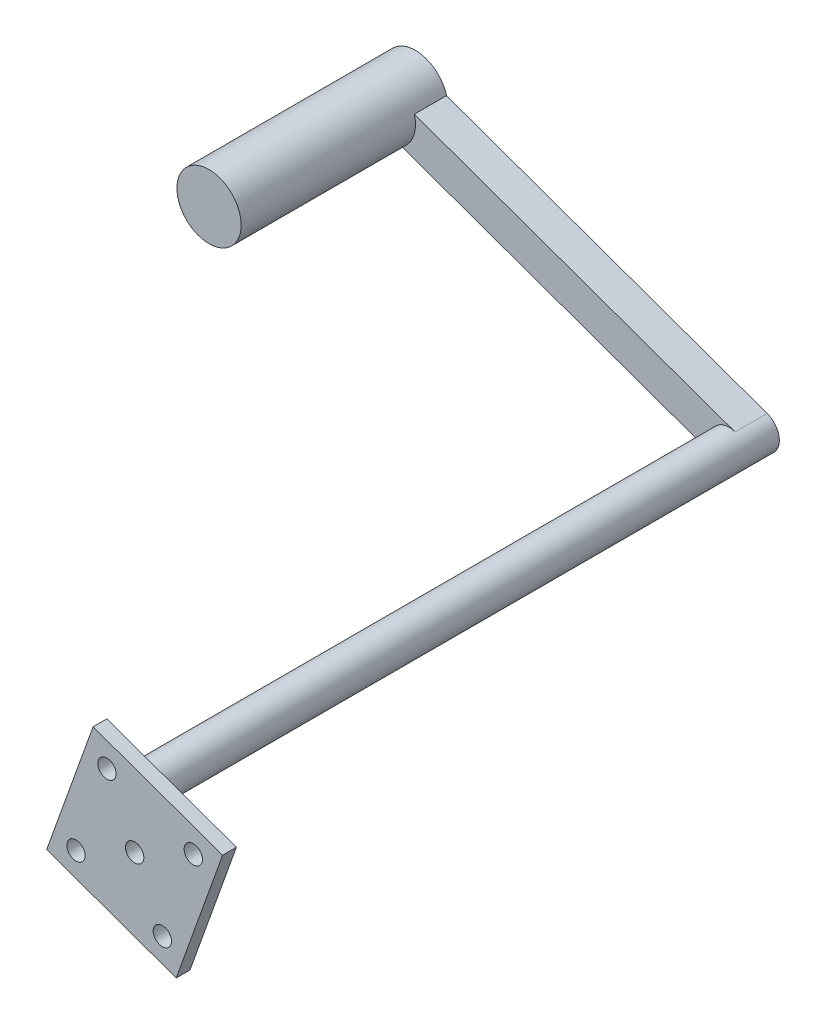
ISO-10303-21;
HEADER;
FILE_DESCRIPTION(('STEP AP214'),'2;1');
FILE_NAME('part.step','',(''),(''),'','','');
FILE_SCHEMA(('AUTOMOTIVE_DESIGN { 1 0 10303 214 1 1 1 1 }'));
ENDSEC;
DATA;
#1=APPLICATION_CONTEXT('core data for automotive mechanical design processes');
#2=APPLICATION_PROTOCOL_DEFINITION('international standard','automotive_design',2000,#1);
#3=PRODUCT_CONTEXT('',#1,'mechanical');
#4=PRODUCT('Part','Part','',(#3));
#5=PRODUCT_RELATED_PRODUCT_CATEGORY('part','',(#4));
#6=PRODUCT_DEFINITION_FORMATION('','',#4);
#7=PRODUCT_DEFINITION_CONTEXT('part definition',#1,'design');
#8=PRODUCT_DEFINITION('design','',#6,#7);
#9=PRODUCT_DEFINITION_SHAPE('','',#8);
#10=(LENGTH_UNIT() NAMED_UNIT(*) SI_UNIT(.MILLI.,.METRE.));
#11=(NAMED_UNIT(*) PLANE_ANGLE_UNIT() SI_UNIT($,.RADIAN.));
#12=(NAMED_UNIT(*) SI_UNIT($,.STERADIAN.) SOLID_ANGLE_UNIT());
#13=UNCERTAINTY_MEASURE_WITH_UNIT(LENGTH_MEASURE(1.E-05),#10,'distance_accuracy_value','');
#14=(GEOMETRIC_REPRESENTATION_CONTEXT(3) GLOBAL_UNCERTAINTY_ASSIGNED_CONTEXT((#13)) GLOBAL_UNIT_ASSIGNED_CONTEXT((#10,
#11,#12)) REPRESENTATION_CONTEXT('',''));
#15=CARTESIAN_POINT('',(0.,0.,0.));
#16=DIRECTION('',(0.,0.,1.));
#17=DIRECTION('',(1.,0.,0.));
#18=AXIS2_PLACEMENT_3D('',#15,#16,#17);
#19=CARTESIAN_POINT('',(-86.6066497970745,-63.7835303855215,45.));
#20=DIRECTION('',(0.,0.,-1.));
#21=DIRECTION('',(-1.,0.,0.));
#22=AXIS2_PLACEMENT_3D('',#19,#20,#21);
#23=CYLINDRICAL_SURFACE('',#22,7.);
#24=CARTESIAN_POINT('',(-86.6066497970745,-63.7835303855215,0.));
#25=DIRECTION('',(0.,0.,1.));
#26=DIRECTION('',(1.,0.,0.));
#27=AXIS2_PLACEMENT_3D('',#24,#25,#26);
#28=CIRCLE('',#27,7.);
#29=CARTESIAN_POINT('',(-79.8496648741146,-61.9551007995401,0.));
#30=VERTEX_POINT('',#29);
#31=CARTESIAN_POINT('',(-82.5475279582593,-69.4864708461657,0.));
#32=VERTEX_POINT('',#31);
#33=EDGE_CURVE('E180',#30,#32,#28,.T.);
#34=ORIENTED_EDGE('',*,*,#33,.T.);
#35=DIRECTION('',(0.,0.,-1.));
#36=VECTOR('',#35,1.);
#37=CARTESIAN_POINT('',(-82.5475279582593,-69.4864708461657,45.));
#38=LINE('',#37,#36);
#39=CARTESIAN_POINT('',(-82.5475279582593,-69.4864708461657,7.));
#40=VERTEX_POINT('',#39);
#41=EDGE_CURVE('E58',#32,#40,#38,.F.);
#42=ORIENTED_EDGE('',*,*,#41,.T.);
#43=CARTESIAN_POINT('',(-86.6066497970745,-63.7835303855215,7.));
#44=DIRECTION('',(0.,0.,-1.));
#45=DIRECTION('',(-1.,0.,0.));
#46=AXIS2_PLACEMENT_3D('',#43,#44,#45);
#47=CIRCLE('',#46,7.);
#48=CARTESIAN_POINT('',(-79.8496648741146,-61.9551007995401,7.));
#49=VERTEX_POINT('',#48);
#50=EDGE_CURVE('E11',#49,#40,#47,.T.);
#51=ORIENTED_EDGE('',*,*,#50,.F.);
#52=DIRECTION('',(0.,0.,-1.));
#53=VECTOR('',#52,1.);
#54=CARTESIAN_POINT('',(-79.8496648741146,-61.9551007995401,45.));
#55=LINE('',#54,#53);
#56=EDGE_CURVE('E172',#49,#30,#55,.T.);
#57=ORIENTED_EDGE('',*,*,#56,.T.);
#58=EDGE_LOOP('',(#34,#42,#51,#57));
#59=FACE_BOUND('',#58,.T.);
#60=CARTESIAN_POINT('',(-86.6066497970745,-63.7835303855215,45.));
#61=DIRECTION('',(0.,0.,1.));
#62=DIRECTION('',(1.,0.,0.));
#63=AXIS2_PLACEMENT_3D('',#60,#61,#62);
#64=CIRCLE('',#63,7.);
#65=CARTESIAN_POINT('',(-79.6066497970745,-63.7835303855215,45.));
#66=VERTEX_POINT('',#65);
#67=EDGE_CURVE('E51',#66,#66,#64,.T.);
#68=ORIENTED_EDGE('',*,*,#67,.F.);
#69=EDGE_LOOP('',(#68));
#70=FACE_BOUND('',#69,.T.);
#71=ADVANCED_FACE('F43',(#59,#70),#23,.T.);
#72=CARTESIAN_POINT('',(-86.6066497970745,-63.7835303855215,45.));
#73=DIRECTION('',(0.,0.,1.));
#74=DIRECTION('',(1.,0.,0.));
#75=AXIS2_PLACEMENT_3D('',#72,#73,#74);
#76=PLANE('',#75);
#77=ORIENTED_EDGE('',*,*,#67,.T.);
#78=EDGE_LOOP('',(#77));
#79=FACE_BOUND('',#78,.T.);
#80=ADVANCED_FACE('F213',(#79),#76,.T.);
#81=CARTESIAN_POINT('',(-86.6066497970745,-63.7835303855215,0.));
#82=DIRECTION('',(0.,0.,1.));
#83=DIRECTION('',(1.,0.,0.));
#84=AXIS2_PLACEMENT_3D('',#81,#82,#83);
#85=PLANE('',#84);
#86=ORIENTED_EDGE('',*,*,#33,.F.);
#87=DIRECTION('',(0.941421255828203,-0.337232885518078,0.));
#88=VECTOR('',#87,1.);
#89=CARTESIAN_POINT('',(-85.2577182550022,-60.0178453622087,0.));
#90=LINE('',#89,#88);
#91=CARTESIAN_POINT('',(-9.94401778874597,-86.9964762036549,0.));
#92=VERTEX_POINT('',#91);
#93=EDGE_CURVE('E148',#30,#92,#90,.T.);
#94=ORIENTED_EDGE('',*,*,#93,.T.);
#95=CARTESIAN_POINT('',(-11.2929493308183,-90.7621612269677,0.));
#96=DIRECTION('',(0.,0.,-1.));
#97=DIRECTION('',(-1.,0.,0.));
#98=AXIS2_PLACEMENT_3D('',#95,#96,#97);
#99=CIRCLE('',#98,4.00000000000002);
#100=CARTESIAN_POINT('',(-12.6418808728906,-94.5278462502806,0.));
#101=VERTEX_POINT('',#100);
#102=EDGE_CURVE('E162',#92,#101,#99,.T.);
#103=ORIENTED_EDGE('',*,*,#102,.T.);
#104=DIRECTION('',(-0.941421255828203,0.337232885518078,0.));
#105=VECTOR('',#104,1.);
#106=CARTESIAN_POINT('',(-87.9555813391469,-67.5492154088343,0.));
#107=LINE('',#106,#105);
#108=EDGE_CURVE('E155',#101,#32,#107,.T.);
#109=ORIENTED_EDGE('',*,*,#108,.T.);
#110=EDGE_LOOP('',(#86,#94,#103,#109));
#111=FACE_BOUND('',#110,.T.);
#112=ADVANCED_FACE('F192',(#111),#85,.F.);
#113=CARTESIAN_POINT('',(-87.9555813391469,-67.5492154088343,7.));
#114=DIRECTION('',(-0.337232885518078,-0.941421255828203,0.));
#115=DIRECTION('',(0.941421255828203,-0.337232885518078,0.));
#116=AXIS2_PLACEMENT_3D('',#113,#114,#115);
#117=PLANE('',#116);
#118=ORIENTED_EDGE('',*,*,#41,.F.);
#119=ORIENTED_EDGE('',*,*,#108,.F.);
#120=DIRECTION('',(0.,0.,-1.));
#121=VECTOR('',#120,1.);
#122=CARTESIAN_POINT('',(-12.6418808728906,-94.5278462502806,7.));
#123=LINE('',#122,#121);
#124=CARTESIAN_POINT('',(-12.6418808728906,-94.5278462502806,7.));
#125=VERTEX_POINT('',#124);
#126=EDGE_CURVE('E169',#125,#101,#123,.T.);
#127=ORIENTED_EDGE('',*,*,#126,.F.);
#128=DIRECTION('',(-0.941421255828203,0.337232885518078,0.));
#129=VECTOR('',#128,1.);
#130=CARTESIAN_POINT('',(-87.9555813391469,-67.5492154088343,7.));
#131=LINE('',#130,#129);
#132=EDGE_CURVE('E154',#125,#40,#131,.T.);
#133=ORIENTED_EDGE('',*,*,#132,.T.);
#134=EDGE_LOOP('',(#118,#119,#127,#133));
#135=FACE_BOUND('',#134,.T.);
#136=ADVANCED_FACE('F190',(#135),#117,.T.);
#137=CARTESIAN_POINT('',(-85.2577182550022,-60.0178453622087,7.));
#138=DIRECTION('',(0.337232885518078,0.941421255828203,0.));
#139=DIRECTION('',(-0.941421255828203,0.337232885518078,0.));
#140=AXIS2_PLACEMENT_3D('',#137,#138,#139);
#141=PLANE('',#140);
#142=ORIENTED_EDGE('',*,*,#56,.F.);
#143=DIRECTION('',(0.941421255828203,-0.337232885518078,0.));
#144=VECTOR('',#143,1.);
#145=CARTESIAN_POINT('',(-85.2577182550022,-60.0178453622087,7.));
#146=LINE('',#145,#144);
#147=CARTESIAN_POINT('',(-9.94401778874597,-86.9964762036549,7.));
#148=VERTEX_POINT('',#147);
#149=EDGE_CURVE('E150',#49,#148,#146,.T.);
#150=ORIENTED_EDGE('',*,*,#149,.T.);
#151=DIRECTION('',(0.,0.,-1.));
#152=VECTOR('',#151,1.);
#153=CARTESIAN_POINT('',(-9.94401778874597,-86.9964762036549,7.));
#154=LINE('',#153,#152);
#155=EDGE_CURVE('E159',#148,#92,#154,.T.);
#156=ORIENTED_EDGE('',*,*,#155,.T.);
#157=ORIENTED_EDGE('',*,*,#93,.F.);
#158=EDGE_LOOP('',(#142,#150,#156,#157));
#159=FACE_BOUND('',#158,.T.);
#160=ADVANCED_FACE('F202',(#159),#141,.T.);
#161=CARTESIAN_POINT('',(-11.2929493308183,-90.7621612269677,7.));
#162=DIRECTION('',(0.,0.,-1.));
#163=DIRECTION('',(-1.,0.,0.));
#164=AXIS2_PLACEMENT_3D('',#161,#162,#163);
#165=CYLINDRICAL_SURFACE('',#164,4.00000000000002);
#166=ORIENTED_EDGE('',*,*,#102,.F.);
#167=ORIENTED_EDGE('',*,*,#155,.F.);
#168=CARTESIAN_POINT('',(-11.2929493308183,-90.7621612269677,7.));
#169=DIRECTION('',(0.,0.,1.));
#170=DIRECTION('',(1.,0.,0.));
#171=AXIS2_PLACEMENT_3D('',#168,#169,#170);
#172=CIRCLE('',#171,4.00000000000002);
#173=EDGE_CURVE('E134',#148,#125,#172,.T.);
#174=ORIENTED_EDGE('',*,*,#173,.T.);
#175=ORIENTED_EDGE('',*,*,#126,.T.);
#176=EDGE_LOOP('',(#166,#167,#174,#175));
#177=FACE_BOUND('',#176,.T.);
#178=CARTESIAN_POINT('',(-11.2929493308183,-90.7621612269677,142.));
#179=DIRECTION('',(0.,0.,1.));
#180=DIRECTION('',(1.,0.,0.));
#181=AXIS2_PLACEMENT_3D('',#178,#179,#180);
#182=CIRCLE('',#181,4.00000000000002);
#183=CARTESIAN_POINT('',(-7.29294933081827,-90.7621612269677,142.));
#184=VERTEX_POINT('',#183);
#185=EDGE_CURVE('E140',#184,#184,#182,.T.);
#186=ORIENTED_EDGE('',*,*,#185,.F.);
#187=EDGE_LOOP('',(#186));
#188=FACE_BOUND('',#187,.T.);
#189=ADVANCED_FACE('F196',(#177,#188),#165,.T.);
#190=CARTESIAN_POINT('',(-86.6066497970745,-63.7835303855215,7.));
#191=DIRECTION('',(0.,0.,-1.));
#192=DIRECTION('',(-1.,0.,0.));
#193=AXIS2_PLACEMENT_3D('',#190,#191,#192);
#194=PLANE('',#193);
#195=ORIENTED_EDGE('',*,*,#173,.F.);
#196=ORIENTED_EDGE('',*,*,#149,.F.);
#197=ORIENTED_EDGE('',*,*,#50,.T.);
#198=ORIENTED_EDGE('',*,*,#132,.F.);
#199=EDGE_LOOP('',(#195,#196,#197,#198));
#200=FACE_BOUND('',#199,.T.);
#201=ADVANCED_FACE('F200',(#200),#194,.F.);
#202=CARTESIAN_POINT('',(0.,0.,145.));
#203=DIRECTION('',(0.,0.,-1.));
#204=DIRECTION('',(-1.,0.,0.));
#205=AXIS2_PLACEMENT_3D('',#202,#203,#204);
#206=PLANE('',#205);
#207=DIRECTION('',(-0.337232885518078,-0.941421255828203,0.));
#208=VECTOR('',#207,1.);
#209=CARTESIAN_POINT('',(-21.9999701485587,-102.860082751282,145.));
#210=LINE('',#209,#208);
#211=CARTESIAN_POINT('',(-11.8829835830164,-74.6174450764363,145.));
#212=VERTEX_POINT('',#211);
#213=CARTESIAN_POINT('',(-21.9999701485587,-102.860082751282,145.));
#214=VERTEX_POINT('',#213);
#215=EDGE_CURVE('E117',#212,#214,#210,.T.);
#216=ORIENTED_EDGE('',*,*,#215,.T.);
#217=DIRECTION('',(0.941421255828203,-0.337232885518078,0.));
#218=VECTOR('',#217,1.);
#219=CARTESIAN_POINT('',(6.2426675262874,-112.977069316825,145.));
#220=LINE('',#219,#218);
#221=CARTESIAN_POINT('',(6.2426675262874,-112.977069316825,145.));
#222=VERTEX_POINT('',#221);
#223=EDGE_CURVE('E105',#214,#222,#220,.T.);
#224=ORIENTED_EDGE('',*,*,#223,.T.);
#225=DIRECTION('',(0.337232885518078,0.941421255828203,0.));
#226=VECTOR('',#225,1.);
#227=CARTESIAN_POINT('',(16.3596540918297,-84.7344316419786,145.));
#228=LINE('',#227,#226);
#229=CARTESIAN_POINT('',(16.3596540918297,-84.7344316419786,145.));
#230=VERTEX_POINT('',#229);
#231=EDGE_CURVE('E116',#222,#230,#228,.T.);
#232=ORIENTED_EDGE('',*,*,#231,.T.);
#233=DIRECTION('',(-0.941421255828203,0.337232885518078,0.));
#234=VECTOR('',#233,1.);
#235=CARTESIAN_POINT('',(-11.8829835830164,-74.6174450764363,145.));
#236=LINE('',#235,#234);
#237=EDGE_CURVE('E123',#230,#212,#236,.T.);
#238=ORIENTED_EDGE('',*,*,#237,.T.);
#239=EDGE_LOOP('',(#216,#224,#232,#238));
#240=FACE_BOUND('',#239,.T.);
#241=CARTESIAN_POINT('',(-8.86204173146574,-81.0107157831677,145.));
#242=DIRECTION('',(0.,0.,1.));
#243=DIRECTION('',(1.,0.,0.));
#244=AXIS2_PLACEMENT_3D('',#241,#242,#243);
#245=CIRCLE('',#244,2.);
#246=CARTESIAN_POINT('',(-6.86204173146574,-81.0107157831677,145.));
#247=VERTEX_POINT('',#246);
#248=EDGE_CURVE('E398',#247,#247,#245,.T.);
#249=ORIENTED_EDGE('',*,*,#248,.F.);
#250=EDGE_LOOP('',(#249));
#251=FACE_BOUND('',#250,.T.);
#252=CARTESIAN_POINT('',(9.96638338509832,-87.7553734935292,145.));
#253=DIRECTION('',(0.,0.,1.));
#254=DIRECTION('',(1.,0.,0.));
#255=AXIS2_PLACEMENT_3D('',#252,#253,#254);
#256=CIRCLE('',#255,2.);
#257=CARTESIAN_POINT('',(11.9663833850983,-87.7553734935292,145.));
#258=VERTEX_POINT('',#257);
#259=EDGE_CURVE('E390',#258,#258,#256,.T.);
#260=ORIENTED_EDGE('',*,*,#259,.F.);
#261=EDGE_LOOP('',(#260));
#262=FACE_BOUND('',#261,.T.);
#263=CARTESIAN_POINT('',(-15.6066994418273,-99.8391408997317,145.));
#264=DIRECTION('',(0.,0.,1.));
#265=DIRECTION('',(1.,0.,0.));
#266=AXIS2_PLACEMENT_3D('',#263,#264,#265);
#267=CIRCLE('',#266,2.);
#268=CARTESIAN_POINT('',(-13.6066994418273,-99.8391408997317,145.));
#269=VERTEX_POINT('',#268);
#270=EDGE_CURVE('E382',#269,#269,#267,.T.);
#271=ORIENTED_EDGE('',*,*,#270,.F.);
#272=EDGE_LOOP('',(#271));
#273=FACE_BOUND('',#272,.T.);
#274=CARTESIAN_POINT('',(3.22172567473678,-106.583798610093,145.));
#275=DIRECTION('',(0.,0.,1.));
#276=DIRECTION('',(1.,0.,0.));
#277=AXIS2_PLACEMENT_3D('',#274,#275,#276);
#278=CIRCLE('',#277,2.);
#279=CARTESIAN_POINT('',(5.22172567473677,-106.583798610093,145.));
#280=VERTEX_POINT('',#279);
#281=EDGE_CURVE('E374',#280,#280,#278,.T.);
#282=ORIENTED_EDGE('',*,*,#281,.F.);
#283=EDGE_LOOP('',(#282));
#284=FACE_BOUND('',#283,.T.);
#285=CARTESIAN_POINT('',(-2.82015802836448,-93.7972571966305,145.));
#286=DIRECTION('',(0.,0.,1.));
#287=DIRECTION('',(1.,0.,0.));
#288=AXIS2_PLACEMENT_3D('',#285,#286,#287);
#289=CIRCLE('',#288,2.);
#290=CARTESIAN_POINT('',(-0.820158028364483,-93.7972571966305,145.));
#291=VERTEX_POINT('',#290);
#292=EDGE_CURVE('E362',#291,#291,#289,.T.);
#293=ORIENTED_EDGE('',*,*,#292,.F.);
#294=EDGE_LOOP('',(#293));
#295=FACE_BOUND('',#294,.T.);
#296=ADVANCED_FACE('F120',(#240,#251,#262,#273,#284,#295),#206,.F.);
#297=CARTESIAN_POINT('',(0.,0.,142.));
#298=DIRECTION('',(0.,0.,-1.));
#299=DIRECTION('',(-1.,0.,0.));
#300=AXIS2_PLACEMENT_3D('',#297,#298,#299);
#301=PLANE('',#300);
#302=ORIENTED_EDGE('',*,*,#185,.T.);
#303=EDGE_LOOP('',(#302));
#304=FACE_BOUND('',#303,.T.);
#305=CARTESIAN_POINT('',(3.22172567473678,-106.583798610093,142.));
#306=DIRECTION('',(0.,0.,1.));
#307=DIRECTION('',(1.,0.,0.));
#308=AXIS2_PLACEMENT_3D('',#305,#306,#307);
#309=CIRCLE('',#308,2.);
#310=CARTESIAN_POINT('',(5.22172567473677,-106.583798610093,142.));
#311=VERTEX_POINT('',#310);
#312=EDGE_CURVE('E371',#311,#311,#309,.T.);
#313=ORIENTED_EDGE('',*,*,#312,.T.);
#314=EDGE_LOOP('',(#313));
#315=FACE_BOUND('',#314,.T.);
#316=CARTESIAN_POINT('',(9.96638338509832,-87.7553734935292,142.));
#317=DIRECTION('',(0.,0.,1.));
#318=DIRECTION('',(1.,0.,0.));
#319=AXIS2_PLACEMENT_3D('',#316,#317,#318);
#320=CIRCLE('',#319,2.);
#321=CARTESIAN_POINT('',(11.9663833850983,-87.7553734935292,142.));
#322=VERTEX_POINT('',#321);
#323=EDGE_CURVE('E386',#322,#322,#320,.T.);
#324=ORIENTED_EDGE('',*,*,#323,.T.);
#325=EDGE_LOOP('',(#324));
#326=FACE_BOUND('',#325,.T.);
#327=DIRECTION('',(-0.337232885518078,-0.941421255828203,0.));
#328=VECTOR('',#327,1.);
#329=CARTESIAN_POINT('',(-21.9999701485587,-102.860082751282,142.));
#330=LINE('',#329,#328);
#331=CARTESIAN_POINT('',(-11.8829835830164,-74.6174450764363,142.));
#332=VERTEX_POINT('',#331);
#333=CARTESIAN_POINT('',(-21.9999701485587,-102.860082751282,142.));
#334=VERTEX_POINT('',#333);
#335=EDGE_CURVE('E132',#332,#334,#330,.T.);
#336=ORIENTED_EDGE('',*,*,#335,.F.);
#337=DIRECTION('',(-0.941421255828203,0.337232885518078,0.));
#338=VECTOR('',#337,1.);
#339=CARTESIAN_POINT('',(-11.8829835830164,-74.6174450764363,142.));
#340=LINE('',#339,#338);
#341=CARTESIAN_POINT('',(16.3596540918297,-84.7344316419786,142.));
#342=VERTEX_POINT('',#341);
#343=EDGE_CURVE('E128',#342,#332,#340,.T.);
#344=ORIENTED_EDGE('',*,*,#343,.F.);
#345=DIRECTION('',(0.337232885518078,0.941421255828203,0.));
#346=VECTOR('',#345,1.);
#347=CARTESIAN_POINT('',(16.3596540918297,-84.7344316419786,142.));
#348=LINE('',#347,#346);
#349=CARTESIAN_POINT('',(6.2426675262874,-112.977069316825,142.));
#350=VERTEX_POINT('',#349);
#351=EDGE_CURVE('E415',#350,#342,#348,.T.);
#352=ORIENTED_EDGE('',*,*,#351,.F.);
#353=DIRECTION('',(0.941421255828203,-0.337232885518078,0.));
#354=VECTOR('',#353,1.);
#355=CARTESIAN_POINT('',(6.2426675262874,-112.977069316825,142.));
#356=LINE('',#355,#354);
#357=EDGE_CURVE('E412',#334,#350,#356,.T.);
#358=ORIENTED_EDGE('',*,*,#357,.F.);
#359=EDGE_LOOP('',(#336,#344,#352,#358));
#360=FACE_BOUND('',#359,.T.);
#361=CARTESIAN_POINT('',(-8.86204173146574,-81.0107157831677,142.));
#362=DIRECTION('',(0.,0.,1.));
#363=DIRECTION('',(1.,0.,0.));
#364=AXIS2_PLACEMENT_3D('',#361,#362,#363);
#365=CIRCLE('',#364,2.);
#366=CARTESIAN_POINT('',(-6.86204173146574,-81.0107157831677,142.));
#367=VERTEX_POINT('',#366);
#368=EDGE_CURVE('E394',#367,#367,#365,.T.);
#369=ORIENTED_EDGE('',*,*,#368,.T.);
#370=EDGE_LOOP('',(#369));
#371=FACE_BOUND('',#370,.T.);
#372=CARTESIAN_POINT('',(-15.6066994418273,-99.8391408997317,142.));
#373=DIRECTION('',(0.,0.,1.));
#374=DIRECTION('',(1.,0.,0.));
#375=AXIS2_PLACEMENT_3D('',#372,#373,#374);
#376=CIRCLE('',#375,2.);
#377=CARTESIAN_POINT('',(-13.6066994418273,-99.8391408997317,142.));
#378=VERTEX_POINT('',#377);
#379=EDGE_CURVE('E378',#378,#378,#376,.T.);
#380=ORIENTED_EDGE('',*,*,#379,.T.);
#381=EDGE_LOOP('',(#380));
#382=FACE_BOUND('',#381,.T.);
#383=CARTESIAN_POINT('',(-2.82015802836448,-93.7972571966305,142.));
#384=DIRECTION('',(0.,0.,1.));
#385=DIRECTION('',(1.,0.,0.));
#386=AXIS2_PLACEMENT_3D('',#383,#384,#385);
#387=CIRCLE('',#386,2.);
#388=CARTESIAN_POINT('',(-0.820158028364483,-93.7972571966305,142.));
#389=VERTEX_POINT('',#388);
#390=EDGE_CURVE('E365',#389,#389,#387,.T.);
#391=ORIENTED_EDGE('',*,*,#390,.T.);
#392=EDGE_LOOP('',(#391));
#393=FACE_BOUND('',#392,.T.);
#394=ADVANCED_FACE('F260',(#304,#315,#326,#360,#371,#382,#393),#301,.T.);
#395=CARTESIAN_POINT('',(-21.9999701485587,-102.860082751282,145.));
#396=DIRECTION('',(0.941421255828203,-0.337232885518078,0.));
#397=DIRECTION('',(0.337232885518078,0.941421255828203,0.));
#398=AXIS2_PLACEMENT_3D('',#395,#396,#397);
#399=PLANE('',#398);
#400=ORIENTED_EDGE('',*,*,#335,.T.);
#401=DIRECTION('',(0.,0.,-1.));
#402=VECTOR('',#401,1.);
#403=CARTESIAN_POINT('',(-21.9999701485587,-102.860082751282,145.));
#404=LINE('',#403,#402);
#405=EDGE_CURVE('E109',#214,#334,#404,.T.);
#406=ORIENTED_EDGE('',*,*,#405,.F.);
#407=ORIENTED_EDGE('',*,*,#215,.F.);
#408=DIRECTION('',(0.,0.,-1.));
#409=VECTOR('',#408,1.);
#410=CARTESIAN_POINT('',(-11.8829835830164,-74.6174450764363,145.));
#411=LINE('',#410,#409);
#412=EDGE_CURVE('E409',#212,#332,#411,.T.);
#413=ORIENTED_EDGE('',*,*,#412,.T.);
#414=EDGE_LOOP('',(#400,#406,#407,#413));
#415=FACE_BOUND('',#414,.T.);
#416=ADVANCED_FACE('F130',(#415),#399,.F.);
#417=CARTESIAN_POINT('',(6.2426675262874,-112.977069316825,145.));
#418=DIRECTION('',(0.337232885518078,0.941421255828203,0.));
#419=DIRECTION('',(-0.941421255828203,0.337232885518078,0.));
#420=AXIS2_PLACEMENT_3D('',#417,#418,#419);
#421=PLANE('',#420);
#422=ORIENTED_EDGE('',*,*,#357,.T.);
#423=DIRECTION('',(0.,0.,-1.));
#424=VECTOR('',#423,1.);
#425=CARTESIAN_POINT('',(6.2426675262874,-112.977069316825,145.));
#426=LINE('',#425,#424);
#427=EDGE_CURVE('E112',#222,#350,#426,.T.);
#428=ORIENTED_EDGE('',*,*,#427,.F.);
#429=ORIENTED_EDGE('',*,*,#223,.F.);
#430=ORIENTED_EDGE('',*,*,#405,.T.);
#431=EDGE_LOOP('',(#422,#428,#429,#430));
#432=FACE_BOUND('',#431,.T.);
#433=ADVANCED_FACE('F107',(#432),#421,.F.);
#434=CARTESIAN_POINT('',(16.3596540918297,-84.7344316419786,145.));
#435=DIRECTION('',(-0.941421255828203,0.337232885518078,0.));
#436=DIRECTION('',(-0.337232885518078,-0.941421255828203,0.));
#437=AXIS2_PLACEMENT_3D('',#434,#435,#436);
#438=PLANE('',#437);
#439=ORIENTED_EDGE('',*,*,#351,.T.);
#440=DIRECTION('',(0.,0.,-1.));
#441=VECTOR('',#440,1.);
#442=CARTESIAN_POINT('',(16.3596540918297,-84.7344316419786,145.));
#443=LINE('',#442,#441);
#444=EDGE_CURVE('E142',#230,#342,#443,.T.);
#445=ORIENTED_EDGE('',*,*,#444,.F.);
#446=ORIENTED_EDGE('',*,*,#231,.F.);
#447=ORIENTED_EDGE('',*,*,#427,.T.);
#448=EDGE_LOOP('',(#439,#445,#446,#447));
#449=FACE_BOUND('',#448,.T.);
#450=ADVANCED_FACE('F282',(#449),#438,.F.);
#451=CARTESIAN_POINT('',(-11.8829835830164,-74.6174450764363,145.));
#452=DIRECTION('',(-0.337232885518078,-0.941421255828203,0.));
#453=DIRECTION('',(0.941421255828203,-0.337232885518078,0.));
#454=AXIS2_PLACEMENT_3D('',#451,#452,#453);
#455=PLANE('',#454);
#456=ORIENTED_EDGE('',*,*,#343,.T.);
#457=ORIENTED_EDGE('',*,*,#412,.F.);
#458=ORIENTED_EDGE('',*,*,#237,.F.);
#459=ORIENTED_EDGE('',*,*,#444,.T.);
#460=EDGE_LOOP('',(#456,#457,#458,#459));
#461=FACE_BOUND('',#460,.T.);
#462=ADVANCED_FACE('F290',(#461),#455,.F.);
#463=CARTESIAN_POINT('',(-8.86204173146574,-81.0107157831677,145.));
#464=DIRECTION('',(0.,0.,-1.));
#465=DIRECTION('',(-1.,0.,0.));
#466=AXIS2_PLACEMENT_3D('',#463,#464,#465);
#467=CYLINDRICAL_SURFACE('',#466,2.);
#468=ORIENTED_EDGE('',*,*,#248,.T.);
#469=EDGE_LOOP('',(#468));
#470=FACE_BOUND('',#469,.T.);
#471=ORIENTED_EDGE('',*,*,#368,.F.);
#472=EDGE_LOOP('',(#471));
#473=FACE_BOUND('',#472,.T.);
#474=ADVANCED_FACE('F299',(#470,#473),#467,.F.);
#475=CARTESIAN_POINT('',(9.96638338509832,-87.7553734935292,145.));
#476=DIRECTION('',(0.,0.,-1.));
#477=DIRECTION('',(-1.,0.,0.));
#478=AXIS2_PLACEMENT_3D('',#475,#476,#477);
#479=CYLINDRICAL_SURFACE('',#478,2.);
#480=ORIENTED_EDGE('',*,*,#259,.T.);
#481=EDGE_LOOP('',(#480));
#482=FACE_BOUND('',#481,.T.);
#483=ORIENTED_EDGE('',*,*,#323,.F.);
#484=EDGE_LOOP('',(#483));
#485=FACE_BOUND('',#484,.T.);
#486=ADVANCED_FACE('F308',(#482,#485),#479,.F.);
#487=CARTESIAN_POINT('',(-15.6066994418273,-99.8391408997317,145.));
#488=DIRECTION('',(0.,0.,-1.));
#489=DIRECTION('',(-1.,0.,0.));
#490=AXIS2_PLACEMENT_3D('',#487,#488,#489);
#491=CYLINDRICAL_SURFACE('',#490,2.);
#492=ORIENTED_EDGE('',*,*,#270,.T.);
#493=EDGE_LOOP('',(#492));
#494=FACE_BOUND('',#493,.T.);
#495=ORIENTED_EDGE('',*,*,#379,.F.);
#496=EDGE_LOOP('',(#495));
#497=FACE_BOUND('',#496,.T.);
#498=ADVANCED_FACE('F317',(#494,#497),#491,.F.);
#499=CARTESIAN_POINT('',(3.22172567473678,-106.583798610093,145.));
#500=DIRECTION('',(0.,0.,-1.));
#501=DIRECTION('',(-1.,0.,0.));
#502=AXIS2_PLACEMENT_3D('',#499,#500,#501);
#503=CYLINDRICAL_SURFACE('',#502,2.);
#504=ORIENTED_EDGE('',*,*,#281,.T.);
#505=EDGE_LOOP('',(#504));
#506=FACE_BOUND('',#505,.T.);
#507=ORIENTED_EDGE('',*,*,#312,.F.);
#508=EDGE_LOOP('',(#507));
#509=FACE_BOUND('',#508,.T.);
#510=ADVANCED_FACE('F326',(#506,#509),#503,.F.);
#511=CARTESIAN_POINT('',(-2.82015802836448,-93.7972571966305,145.));
#512=DIRECTION('',(0.,0.,-1.));
#513=DIRECTION('',(-1.,0.,0.));
#514=AXIS2_PLACEMENT_3D('',#511,#512,#513);
#515=CYLINDRICAL_SURFACE('',#514,2.);
#516=ORIENTED_EDGE('',*,*,#292,.T.);
#517=EDGE_LOOP('',(#516));
#518=FACE_BOUND('',#517,.T.);
#519=ORIENTED_EDGE('',*,*,#390,.F.);
#520=EDGE_LOOP('',(#519));
#521=FACE_BOUND('',#520,.T.);
#522=ADVANCED_FACE('F335',(#518,#521),#515,.F.);
#523=CLOSED_SHELL('',(#71,#80,#112,#136,#160,#189,#201,#296,#394,#416,#433,#450,#462,#474,#486,
#498,#510,#522));
#524=MANIFOLD_SOLID_BREP('B2',#523);
#525=ADVANCED_BREP_SHAPE_REPRESENTATION('',(#18,#524),#14);
#526=SHAPE_DEFINITION_REPRESENTATION(#9,#525);
ENDSEC;
END-ISO-10303-21;
